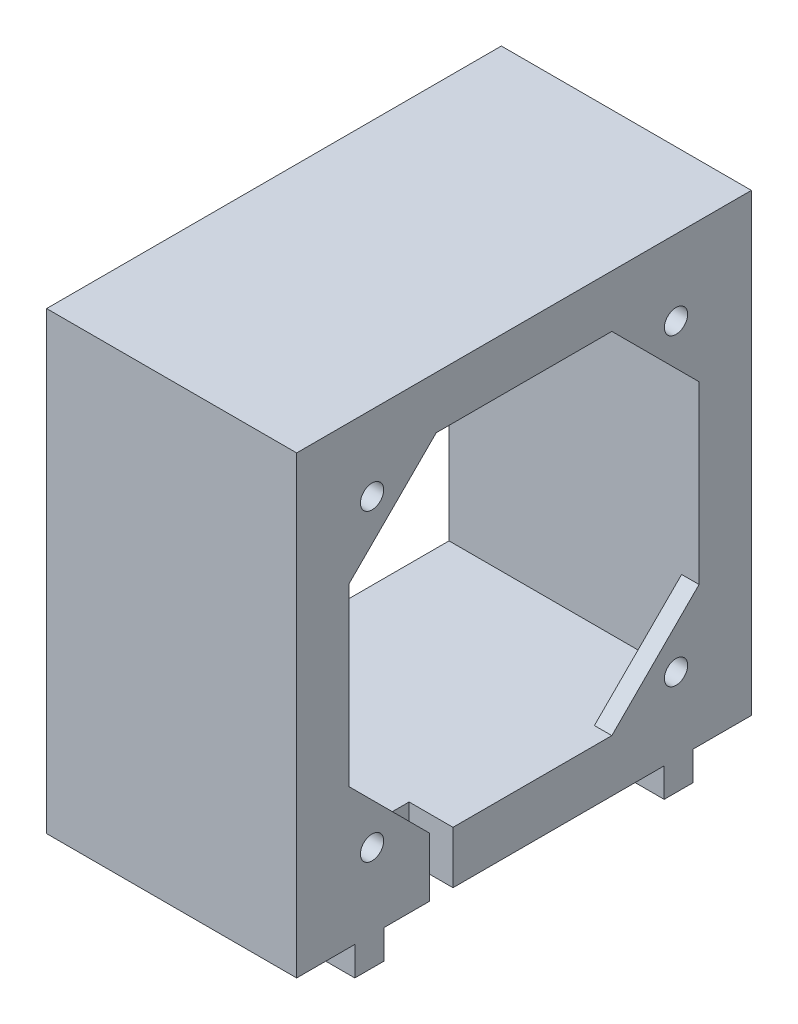
ISO-10303-21;
HEADER;
FILE_DESCRIPTION(('STEP AP214'),'2;1');
FILE_NAME('part.step','',(''),(''),'','','');
FILE_SCHEMA(('AUTOMOTIVE_DESIGN { 1 0 10303 214 1 1 1 1 }'));
ENDSEC;
DATA;
#1=APPLICATION_CONTEXT('core data for automotive mechanical design processes');
#2=APPLICATION_PROTOCOL_DEFINITION('international standard','automotive_design',2000,#1);
#3=PRODUCT_CONTEXT('',#1,'mechanical');
#4=PRODUCT('Part','Part','',(#3));
#5=PRODUCT_RELATED_PRODUCT_CATEGORY('part','',(#4));
#6=PRODUCT_DEFINITION_FORMATION('','',#4);
#7=PRODUCT_DEFINITION_CONTEXT('part definition',#1,'design');
#8=PRODUCT_DEFINITION('design','',#6,#7);
#9=PRODUCT_DEFINITION_SHAPE('','',#8);
#10=(LENGTH_UNIT() NAMED_UNIT(*) SI_UNIT(.MILLI.,.METRE.));
#11=(NAMED_UNIT(*) PLANE_ANGLE_UNIT() SI_UNIT($,.RADIAN.));
#12=(NAMED_UNIT(*) SI_UNIT($,.STERADIAN.) SOLID_ANGLE_UNIT());
#13=UNCERTAINTY_MEASURE_WITH_UNIT(LENGTH_MEASURE(1.E-05),#10,'distance_accuracy_value','');
#14=(GEOMETRIC_REPRESENTATION_CONTEXT(3) GLOBAL_UNCERTAINTY_ASSIGNED_CONTEXT((#13)) GLOBAL_UNIT_ASSIGNED_CONTEXT((#10,
#11,#12)) REPRESENTATION_CONTEXT('',''));
#15=CARTESIAN_POINT('',(0.,0.,0.));
#16=DIRECTION('',(0.,0.,1.));
#17=DIRECTION('',(1.,0.,0.));
#18=AXIS2_PLACEMENT_3D('',#15,#16,#17);
#19=CARTESIAN_POINT('',(40.,-39.1,-39.1));
#20=DIRECTION('',(0.,1.,0.));
#21=DIRECTION('',(0.,0.,1.));
#22=AXIS2_PLACEMENT_3D('',#19,#20,#21);
#23=PLANE('',#22);
#24=DIRECTION('',(1.,0.,0.));
#25=VECTOR('',#24,1.);
#26=CARTESIAN_POINT('',(13.,-39.1,24.1));
#27=LINE('',#26,#25);
#28=CARTESIAN_POINT('',(13.,-39.1,24.1));
#29=VERTEX_POINT('',#28);
#30=CARTESIAN_POINT('',(43.,-39.1,24.1));
#31=VERTEX_POINT('',#30);
#32=EDGE_CURVE('E256',#29,#31,#27,.T.);
#33=ORIENTED_EDGE('',*,*,#32,.F.);
#34=DIRECTION('',(0.,0.,-1.));
#35=VECTOR('',#34,1.);
#36=CARTESIAN_POINT('',(13.,-39.1,29.1));
#37=LINE('',#36,#35);
#38=CARTESIAN_POINT('',(13.,-39.1,29.1));
#39=VERTEX_POINT('',#38);
#40=EDGE_CURVE('E263',#39,#29,#37,.T.);
#41=ORIENTED_EDGE('',*,*,#40,.F.);
#42=DIRECTION('',(-1.,0.,0.));
#43=VECTOR('',#42,1.);
#44=CARTESIAN_POINT('',(13.,-39.1,29.1));
#45=LINE('',#44,#43);
#46=CARTESIAN_POINT('',(43.,-39.1,29.1));
#47=VERTEX_POINT('',#46);
#48=EDGE_CURVE('E245',#47,#39,#45,.T.);
#49=ORIENTED_EDGE('',*,*,#48,.F.);
#50=DIRECTION('',(0.,0.,-1.));
#51=VECTOR('',#50,1.);
#52=CARTESIAN_POINT('',(43.,-39.1,0.));
#53=LINE('',#52,#51);
#54=CARTESIAN_POINT('',(43.,-39.1,39.1));
#55=VERTEX_POINT('',#54);
#56=EDGE_CURVE('E380',#55,#47,#53,.T.);
#57=ORIENTED_EDGE('',*,*,#56,.F.);
#58=DIRECTION('',(-1.,0.,0.));
#59=VECTOR('',#58,1.);
#60=CARTESIAN_POINT('',(40.,-39.1,39.1));
#61=LINE('',#60,#59);
#62=CARTESIAN_POINT('',(0.,-39.1,39.1));
#63=VERTEX_POINT('',#62);
#64=EDGE_CURVE('E503',#55,#63,#61,.T.);
#65=ORIENTED_EDGE('',*,*,#64,.T.);
#66=DIRECTION('',(0.,0.,-1.));
#67=VECTOR('',#66,1.);
#68=CARTESIAN_POINT('',(0.,-39.1,-39.1));
#69=LINE('',#68,#67);
#70=CARTESIAN_POINT('',(0.,-39.1,-39.1));
#71=VERTEX_POINT('',#70);
#72=EDGE_CURVE('E488',#63,#71,#69,.T.);
#73=ORIENTED_EDGE('',*,*,#72,.T.);
#74=DIRECTION('',(-1.,0.,0.));
#75=VECTOR('',#74,1.);
#76=CARTESIAN_POINT('',(40.,-39.1,-39.1));
#77=LINE('',#76,#75);
#78=CARTESIAN_POINT('',(43.,-39.1,-39.1));
#79=VERTEX_POINT('',#78);
#80=EDGE_CURVE('E500',#79,#71,#77,.T.);
#81=ORIENTED_EDGE('',*,*,#80,.F.);
#82=CARTESIAN_POINT('',(43.,-39.1,-29.1));
#83=VERTEX_POINT('',#82);
#84=EDGE_CURVE('E379',#83,#79,#53,.T.);
#85=ORIENTED_EDGE('',*,*,#84,.F.);
#86=DIRECTION('',(1.,0.,0.));
#87=VECTOR('',#86,1.);
#88=CARTESIAN_POINT('',(13.,-39.1,-29.1));
#89=LINE('',#88,#87);
#90=CARTESIAN_POINT('',(13.,-39.1,-29.1));
#91=VERTEX_POINT('',#90);
#92=EDGE_CURVE('E270',#91,#83,#89,.T.);
#93=ORIENTED_EDGE('',*,*,#92,.F.);
#94=DIRECTION('',(0.,0.,-1.));
#95=VECTOR('',#94,1.);
#96=CARTESIAN_POINT('',(13.,-39.1,-29.1));
#97=LINE('',#96,#95);
#98=CARTESIAN_POINT('',(13.,-39.1,-24.1));
#99=VERTEX_POINT('',#98);
#100=EDGE_CURVE('E79',#99,#91,#97,.T.);
#101=ORIENTED_EDGE('',*,*,#100,.F.);
#102=DIRECTION('',(-1.,0.,0.));
#103=VECTOR('',#102,1.);
#104=CARTESIAN_POINT('',(13.,-39.1,-24.1));
#105=LINE('',#104,#103);
#106=CARTESIAN_POINT('',(43.,-39.1,-24.1));
#107=VERTEX_POINT('',#106);
#108=EDGE_CURVE('E284',#107,#99,#105,.T.);
#109=ORIENTED_EDGE('',*,*,#108,.F.);
#110=CARTESIAN_POINT('',(43.,-39.1,12.2154793160125));
#111=VERTEX_POINT('',#110);
#112=EDGE_CURVE('E384',#111,#107,#53,.T.);
#113=ORIENTED_EDGE('',*,*,#112,.F.);
#114=DIRECTION('',(-1.,0.,0.));
#115=VECTOR('',#114,1.);
#116=CARTESIAN_POINT('',(40.,-39.1,12.2154793160125));
#117=LINE('',#116,#115);
#118=CARTESIAN_POINT('',(35.4507809805433,-39.1,12.2154793160125));
#119=VERTEX_POINT('',#118);
#120=EDGE_CURVE('E340',#111,#119,#117,.T.);
#121=ORIENTED_EDGE('',*,*,#120,.T.);
#122=DIRECTION('',(0.,0.,1.));
#123=VECTOR('',#122,1.);
#124=CARTESIAN_POINT('',(35.4507809805433,-39.1,-39.1));
#125=LINE('',#124,#123);
#126=CARTESIAN_POINT('',(35.4507809805433,-39.1,16.2154793160125));
#127=VERTEX_POINT('',#126);
#128=EDGE_CURVE('E343',#119,#127,#125,.T.);
#129=ORIENTED_EDGE('',*,*,#128,.T.);
#130=DIRECTION('',(1.,0.,0.));
#131=VECTOR('',#130,1.);
#132=CARTESIAN_POINT('',(40.,-39.1,16.2154793160125));
#133=LINE('',#132,#131);
#134=CARTESIAN_POINT('',(43.,-39.1,16.2154793160125));
#135=VERTEX_POINT('',#134);
#136=EDGE_CURVE('E335',#127,#135,#133,.T.);
#137=ORIENTED_EDGE('',*,*,#136,.T.);
#138=EDGE_CURVE('E383',#31,#135,#53,.T.);
#139=ORIENTED_EDGE('',*,*,#138,.F.);
#140=EDGE_LOOP('',(#33,#41,#49,#57,#65,#73,#81,#85,#93,#101,#109,#113,#121,#129,#137,#139));
#141=FACE_BOUND('',#140,.T.);
#142=ADVANCED_FACE('F54',(#141),#23,.F.);
#143=CARTESIAN_POINT('',(0.,0.,0.));
#144=DIRECTION('',(-1.,0.,0.));
#145=DIRECTION('',(0.,0.,1.));
#146=AXIS2_PLACEMENT_3D('',#143,#144,#145);
#147=PLANE('',#146);
#148=CARTESIAN_POINT('',(0.,34.6,-34.6));
#149=DIRECTION('',(-1.,0.,0.));
#150=DIRECTION('',(0.,0.,1.));
#151=AXIS2_PLACEMENT_3D('',#148,#149,#150);
#152=CIRCLE('',#151,4.1);
#153=CARTESIAN_POINT('',(0.,34.6,-30.5));
#154=VERTEX_POINT('',#153);
#155=EDGE_CURVE('E58',#154,#154,#152,.T.);
#156=ORIENTED_EDGE('',*,*,#155,.F.);
#157=EDGE_LOOP('',(#156));
#158=FACE_BOUND('',#157,.T.);
#159=CARTESIAN_POINT('',(0.,-34.6,-34.6));
#160=DIRECTION('',(-1.,0.,0.));
#161=DIRECTION('',(0.,0.,1.));
#162=AXIS2_PLACEMENT_3D('',#159,#160,#161);
#163=CIRCLE('',#162,4.1);
#164=CARTESIAN_POINT('',(0.,-34.6,-30.5));
#165=VERTEX_POINT('',#164);
#166=EDGE_CURVE('E514',#165,#165,#163,.T.);
#167=ORIENTED_EDGE('',*,*,#166,.F.);
#168=EDGE_LOOP('',(#167));
#169=FACE_BOUND('',#168,.T.);
#170=CARTESIAN_POINT('',(0.,-34.6,34.6));
#171=DIRECTION('',(-1.,0.,0.));
#172=DIRECTION('',(0.,0.,1.));
#173=AXIS2_PLACEMENT_3D('',#170,#171,#172);
#174=CIRCLE('',#173,4.1);
#175=CARTESIAN_POINT('',(0.,-34.6,38.7));
#176=VERTEX_POINT('',#175);
#177=EDGE_CURVE('E512',#176,#176,#174,.T.);
#178=ORIENTED_EDGE('',*,*,#177,.F.);
#179=EDGE_LOOP('',(#178));
#180=FACE_BOUND('',#179,.T.);
#181=CARTESIAN_POINT('',(0.,34.6,34.6));
#182=DIRECTION('',(-1.,0.,0.));
#183=DIRECTION('',(0.,0.,1.));
#184=AXIS2_PLACEMENT_3D('',#181,#182,#183);
#185=CIRCLE('',#184,4.1);
#186=CARTESIAN_POINT('',(0.,34.6,38.7));
#187=VERTEX_POINT('',#186);
#188=EDGE_CURVE('E321',#187,#187,#185,.T.);
#189=ORIENTED_EDGE('',*,*,#188,.F.);
#190=EDGE_LOOP('',(#189));
#191=FACE_BOUND('',#190,.T.);
#192=DIRECTION('',(0.,-1.,0.));
#193=VECTOR('',#192,1.);
#194=CARTESIAN_POINT('',(0.,39.1,39.1));
#195=LINE('',#194,#193);
#196=CARTESIAN_POINT('',(0.,39.1,39.1));
#197=VERTEX_POINT('',#196);
#198=EDGE_CURVE('E485',#197,#63,#195,.T.);
#199=ORIENTED_EDGE('',*,*,#198,.F.);
#200=DIRECTION('',(0.,0.,1.));
#201=VECTOR('',#200,1.);
#202=CARTESIAN_POINT('',(0.,39.1,-39.1));
#203=LINE('',#202,#201);
#204=CARTESIAN_POINT('',(0.,39.1,-39.1));
#205=VERTEX_POINT('',#204);
#206=EDGE_CURVE('E492',#205,#197,#203,.T.);
#207=ORIENTED_EDGE('',*,*,#206,.F.);
#208=DIRECTION('',(0.,1.,0.));
#209=VECTOR('',#208,1.);
#210=CARTESIAN_POINT('',(0.,39.1,-39.1));
#211=LINE('',#210,#209);
#212=EDGE_CURVE('E490',#71,#205,#211,.T.);
#213=ORIENTED_EDGE('',*,*,#212,.F.);
#214=ORIENTED_EDGE('',*,*,#72,.F.);
#215=EDGE_LOOP('',(#199,#207,#213,#214));
#216=FACE_BOUND('',#215,.T.);
#217=DIRECTION('',(0.,0.,1.));
#218=VECTOR('',#217,1.);
#219=CARTESIAN_POINT('',(0.,30.1,-30.1));
#220=LINE('',#219,#218);
#221=CARTESIAN_POINT('',(0.,30.1,-30.1));
#222=VERTEX_POINT('',#221);
#223=CARTESIAN_POINT('',(0.,30.1,30.1));
#224=VERTEX_POINT('',#223);
#225=EDGE_CURVE('E471',#222,#224,#220,.T.);
#226=ORIENTED_EDGE('',*,*,#225,.T.);
#227=DIRECTION('',(0.,-1.,0.));
#228=VECTOR('',#227,1.);
#229=CARTESIAN_POINT('',(0.,30.1,30.1));
#230=LINE('',#229,#228);
#231=CARTESIAN_POINT('',(0.,-30.1,30.1));
#232=VERTEX_POINT('',#231);
#233=EDGE_CURVE('E442',#224,#232,#230,.T.);
#234=ORIENTED_EDGE('',*,*,#233,.T.);
#235=DIRECTION('',(0.,0.,-1.));
#236=VECTOR('',#235,1.);
#237=CARTESIAN_POINT('',(0.,-30.1,-30.1));
#238=LINE('',#237,#236);
#239=CARTESIAN_POINT('',(0.,-30.1,-30.1));
#240=VERTEX_POINT('',#239);
#241=EDGE_CURVE('E464',#232,#240,#238,.T.);
#242=ORIENTED_EDGE('',*,*,#241,.T.);
#243=DIRECTION('',(0.,1.,0.));
#244=VECTOR('',#243,1.);
#245=CARTESIAN_POINT('',(0.,30.1,-30.1));
#246=LINE('',#245,#244);
#247=EDGE_CURVE('E467',#240,#222,#246,.T.);
#248=ORIENTED_EDGE('',*,*,#247,.T.);
#249=EDGE_LOOP('',(#226,#234,#242,#248));
#250=FACE_BOUND('',#249,.T.);
#251=ADVANCED_FACE('F524',(#158,#169,#180,#191,#216,#250),#147,.T.);
#252=CARTESIAN_POINT('',(40.,39.1,39.1));
#253=DIRECTION('',(0.,0.,-1.));
#254=DIRECTION('',(-1.,0.,0.));
#255=AXIS2_PLACEMENT_3D('',#252,#253,#254);
#256=PLANE('',#255);
#257=ORIENTED_EDGE('',*,*,#198,.T.);
#258=ORIENTED_EDGE('',*,*,#64,.F.);
#259=DIRECTION('',(0.,-1.,0.));
#260=VECTOR('',#259,1.);
#261=CARTESIAN_POINT('',(43.,0.,39.1));
#262=LINE('',#261,#260);
#263=CARTESIAN_POINT('',(43.,39.1,39.1));
#264=VERTEX_POINT('',#263);
#265=EDGE_CURVE('E376',#264,#55,#262,.T.);
#266=ORIENTED_EDGE('',*,*,#265,.F.);
#267=DIRECTION('',(-1.,0.,0.));
#268=VECTOR('',#267,1.);
#269=CARTESIAN_POINT('',(40.,39.1,39.1));
#270=LINE('',#269,#268);
#271=EDGE_CURVE('E494',#264,#197,#270,.T.);
#272=ORIENTED_EDGE('',*,*,#271,.T.);
#273=EDGE_LOOP('',(#257,#258,#266,#272));
#274=FACE_BOUND('',#273,.T.);
#275=ADVANCED_FACE('F56',(#274),#256,.F.);
#276=CARTESIAN_POINT('',(40.,39.1,-39.1));
#277=DIRECTION('',(0.,0.,1.));
#278=DIRECTION('',(1.,0.,0.));
#279=AXIS2_PLACEMENT_3D('',#276,#277,#278);
#280=PLANE('',#279);
#281=ORIENTED_EDGE('',*,*,#212,.T.);
#282=DIRECTION('',(-1.,0.,0.));
#283=VECTOR('',#282,1.);
#284=CARTESIAN_POINT('',(40.,39.1,-39.1));
#285=LINE('',#284,#283);
#286=CARTESIAN_POINT('',(43.,39.1,-39.1));
#287=VERTEX_POINT('',#286);
#288=EDGE_CURVE('E497',#287,#205,#285,.T.);
#289=ORIENTED_EDGE('',*,*,#288,.F.);
#290=DIRECTION('',(0.,1.,0.));
#291=VECTOR('',#290,1.);
#292=CARTESIAN_POINT('',(43.,0.,-39.1));
#293=LINE('',#292,#291);
#294=EDGE_CURVE('E382',#79,#287,#293,.T.);
#295=ORIENTED_EDGE('',*,*,#294,.F.);
#296=ORIENTED_EDGE('',*,*,#80,.T.);
#297=EDGE_LOOP('',(#281,#289,#295,#296));
#298=FACE_BOUND('',#297,.T.);
#299=ADVANCED_FACE('F610',(#298),#280,.F.);
#300=CARTESIAN_POINT('',(40.,39.1,-39.1));
#301=DIRECTION('',(0.,-1.,0.));
#302=DIRECTION('',(0.,0.,-1.));
#303=AXIS2_PLACEMENT_3D('',#300,#301,#302);
#304=PLANE('',#303);
#305=ORIENTED_EDGE('',*,*,#206,.T.);
#306=ORIENTED_EDGE('',*,*,#271,.F.);
#307=DIRECTION('',(0.,0.,1.));
#308=VECTOR('',#307,1.);
#309=CARTESIAN_POINT('',(43.,39.1,0.));
#310=LINE('',#309,#308);
#311=EDGE_CURVE('E373',#287,#264,#310,.T.);
#312=ORIENTED_EDGE('',*,*,#311,.F.);
#313=ORIENTED_EDGE('',*,*,#288,.T.);
#314=EDGE_LOOP('',(#305,#306,#312,#313));
#315=FACE_BOUND('',#314,.T.);
#316=ADVANCED_FACE('F613',(#315),#304,.F.);
#317=CARTESIAN_POINT('',(40.,30.1,30.1));
#318=DIRECTION('',(0.,0.,-1.));
#319=DIRECTION('',(0.,1.,0.));
#320=AXIS2_PLACEMENT_3D('',#317,#318,#319);
#321=PLANE('',#320);
#322=ORIENTED_EDGE('',*,*,#233,.F.);
#323=DIRECTION('',(-1.,0.,0.));
#324=VECTOR('',#323,1.);
#325=CARTESIAN_POINT('',(40.,30.1,30.1));
#326=LINE('',#325,#324);
#327=CARTESIAN_POINT('',(40.,30.1,30.1));
#328=VERTEX_POINT('',#327);
#329=EDGE_CURVE('E461',#328,#224,#326,.T.);
#330=ORIENTED_EDGE('',*,*,#329,.F.);
#331=DIRECTION('',(0.,-1.,0.));
#332=VECTOR('',#331,1.);
#333=CARTESIAN_POINT('',(40.,30.1,30.1));
#334=LINE('',#333,#332);
#335=CARTESIAN_POINT('',(40.,15.1,30.1));
#336=VERTEX_POINT('',#335);
#337=EDGE_CURVE('E443',#328,#336,#334,.T.);
#338=ORIENTED_EDGE('',*,*,#337,.T.);
#339=DIRECTION('',(-1.,0.,0.));
#340=VECTOR('',#339,1.);
#341=CARTESIAN_POINT('',(43.,15.1,30.1));
#342=LINE('',#341,#340);
#343=CARTESIAN_POINT('',(43.,15.1,30.1));
#344=VERTEX_POINT('',#343);
#345=EDGE_CURVE('E434',#344,#336,#342,.T.);
#346=ORIENTED_EDGE('',*,*,#345,.F.);
#347=DIRECTION('',(0.,1.,0.));
#348=VECTOR('',#347,1.);
#349=CARTESIAN_POINT('',(43.,0.,30.1));
#350=LINE('',#349,#348);
#351=CARTESIAN_POINT('',(43.,-15.0999999999999,30.1));
#352=VERTEX_POINT('',#351);
#353=EDGE_CURVE('E357',#352,#344,#350,.T.);
#354=ORIENTED_EDGE('',*,*,#353,.F.);
#355=DIRECTION('',(-1.,0.,0.));
#356=VECTOR('',#355,1.);
#357=CARTESIAN_POINT('',(43.,-15.0999999999999,30.1));
#358=LINE('',#357,#356);
#359=CARTESIAN_POINT('',(40.,-15.0999999999999,30.1));
#360=VERTEX_POINT('',#359);
#361=EDGE_CURVE('E436',#352,#360,#358,.T.);
#362=ORIENTED_EDGE('',*,*,#361,.T.);
#363=CARTESIAN_POINT('',(40.,-30.1,30.1));
#364=VERTEX_POINT('',#363);
#365=EDGE_CURVE('E447',#360,#364,#334,.T.);
#366=ORIENTED_EDGE('',*,*,#365,.T.);
#367=DIRECTION('',(-1.,0.,0.));
#368=VECTOR('',#367,1.);
#369=CARTESIAN_POINT('',(40.,-30.1,30.1));
#370=LINE('',#369,#368);
#371=EDGE_CURVE('E482',#364,#232,#370,.T.);
#372=ORIENTED_EDGE('',*,*,#371,.T.);
#373=EDGE_LOOP('',(#322,#330,#338,#346,#354,#362,#366,#372));
#374=FACE_BOUND('',#373,.T.);
#375=ADVANCED_FACE('F544',(#374),#321,.T.);
#376=CARTESIAN_POINT('',(40.,-30.1,-30.1));
#377=DIRECTION('',(0.,1.,0.));
#378=DIRECTION('',(0.,0.,1.));
#379=AXIS2_PLACEMENT_3D('',#376,#377,#378);
#380=PLANE('',#379);
#381=DIRECTION('',(-1.,0.,0.));
#382=VECTOR('',#381,1.);
#383=CARTESIAN_POINT('',(40.,-30.1,12.2154793160125));
#384=LINE('',#383,#382);
#385=CARTESIAN_POINT('',(43.,-30.1,12.2154793160125));
#386=VERTEX_POINT('',#385);
#387=CARTESIAN_POINT('',(35.4507809805433,-30.1,12.2154793160125));
#388=VERTEX_POINT('',#387);
#389=EDGE_CURVE('E338',#386,#388,#384,.T.);
#390=ORIENTED_EDGE('',*,*,#389,.F.);
#391=DIRECTION('',(0.,0.,1.));
#392=VECTOR('',#391,1.);
#393=CARTESIAN_POINT('',(43.,-30.1,0.));
#394=LINE('',#393,#392);
#395=CARTESIAN_POINT('',(43.,-30.1,-15.0999999999999));
#396=VERTEX_POINT('',#395);
#397=EDGE_CURVE('E350',#396,#386,#394,.T.);
#398=ORIENTED_EDGE('',*,*,#397,.F.);
#399=DIRECTION('',(-1.,0.,0.));
#400=VECTOR('',#399,1.);
#401=CARTESIAN_POINT('',(43.,-30.1,-15.0999999999999));
#402=LINE('',#401,#400);
#403=CARTESIAN_POINT('',(40.,-30.1,-15.0999999999999));
#404=VERTEX_POINT('',#403);
#405=EDGE_CURVE('E439',#396,#404,#402,.T.);
#406=ORIENTED_EDGE('',*,*,#405,.T.);
#407=DIRECTION('',(0.,0.,-1.));
#408=VECTOR('',#407,1.);
#409=CARTESIAN_POINT('',(40.,-30.1,-30.1));
#410=LINE('',#409,#408);
#411=CARTESIAN_POINT('',(40.,-30.1,-30.1));
#412=VERTEX_POINT('',#411);
#413=EDGE_CURVE('E446',#404,#412,#410,.T.);
#414=ORIENTED_EDGE('',*,*,#413,.T.);
#415=DIRECTION('',(-1.,0.,0.));
#416=VECTOR('',#415,1.);
#417=CARTESIAN_POINT('',(40.,-30.1,-30.1));
#418=LINE('',#417,#416);
#419=EDGE_CURVE('E479',#412,#240,#418,.T.);
#420=ORIENTED_EDGE('',*,*,#419,.T.);
#421=ORIENTED_EDGE('',*,*,#241,.F.);
#422=ORIENTED_EDGE('',*,*,#371,.F.);
#423=CARTESIAN_POINT('',(40.,-30.1,16.2154793160125));
#424=VERTEX_POINT('',#423);
#425=EDGE_CURVE('E448',#364,#424,#410,.T.);
#426=ORIENTED_EDGE('',*,*,#425,.T.);
#427=DIRECTION('',(1.,0.,0.));
#428=VECTOR('',#427,1.);
#429=CARTESIAN_POINT('',(40.,-30.1,16.2154793160125));
#430=LINE('',#429,#428);
#431=CARTESIAN_POINT('',(35.4507809805433,-30.1,16.2154793160125));
#432=VERTEX_POINT('',#431);
#433=EDGE_CURVE('E333',#432,#424,#430,.T.);
#434=ORIENTED_EDGE('',*,*,#433,.F.);
#435=DIRECTION('',(0.,0.,1.));
#436=VECTOR('',#435,1.);
#437=CARTESIAN_POINT('',(35.4507809805433,-30.1,-30.1));
#438=LINE('',#437,#436);
#439=EDGE_CURVE('E12',#388,#432,#438,.T.);
#440=ORIENTED_EDGE('',*,*,#439,.F.);
#441=EDGE_LOOP('',(#390,#398,#406,#414,#420,#421,#422,#426,#434,#440));
#442=FACE_BOUND('',#441,.T.);
#443=ADVANCED_FACE('F550',(#442),#380,.T.);
#444=CARTESIAN_POINT('',(40.,30.1,-30.1));
#445=DIRECTION('',(0.,0.,1.));
#446=DIRECTION('',(0.,-1.,0.));
#447=AXIS2_PLACEMENT_3D('',#444,#445,#446);
#448=PLANE('',#447);
#449=ORIENTED_EDGE('',*,*,#247,.F.);
#450=ORIENTED_EDGE('',*,*,#419,.F.);
#451=DIRECTION('',(0.,1.,0.));
#452=VECTOR('',#451,1.);
#453=CARTESIAN_POINT('',(40.,30.1,-30.1));
#454=LINE('',#453,#452);
#455=CARTESIAN_POINT('',(40.,-15.1000000000001,-30.1));
#456=VERTEX_POINT('',#455);
#457=EDGE_CURVE('E452',#412,#456,#454,.T.);
#458=ORIENTED_EDGE('',*,*,#457,.T.);
#459=DIRECTION('',(-1.,0.,0.));
#460=VECTOR('',#459,1.);
#461=CARTESIAN_POINT('',(43.,-15.1000000000001,-30.1));
#462=LINE('',#461,#460);
#463=CARTESIAN_POINT('',(43.,-15.1000000000001,-30.1));
#464=VERTEX_POINT('',#463);
#465=EDGE_CURVE('E396',#464,#456,#462,.T.);
#466=ORIENTED_EDGE('',*,*,#465,.F.);
#467=DIRECTION('',(0.,-1.,0.));
#468=VECTOR('',#467,1.);
#469=CARTESIAN_POINT('',(43.,0.,-30.1));
#470=LINE('',#469,#468);
#471=CARTESIAN_POINT('',(43.,15.0999999999999,-30.1));
#472=VERTEX_POINT('',#471);
#473=EDGE_CURVE('E367',#472,#464,#470,.T.);
#474=ORIENTED_EDGE('',*,*,#473,.F.);
#475=DIRECTION('',(-1.,0.,0.));
#476=VECTOR('',#475,1.);
#477=CARTESIAN_POINT('',(43.,15.0999999999999,-30.1));
#478=LINE('',#477,#476);
#479=CARTESIAN_POINT('',(40.,15.0999999999999,-30.1));
#480=VERTEX_POINT('',#479);
#481=EDGE_CURVE('E425',#472,#480,#478,.T.);
#482=ORIENTED_EDGE('',*,*,#481,.T.);
#483=CARTESIAN_POINT('',(40.,30.1,-30.1));
#484=VERTEX_POINT('',#483);
#485=EDGE_CURVE('E451',#480,#484,#454,.T.);
#486=ORIENTED_EDGE('',*,*,#485,.T.);
#487=DIRECTION('',(-1.,0.,0.));
#488=VECTOR('',#487,1.);
#489=CARTESIAN_POINT('',(40.,30.1,-30.1));
#490=LINE('',#489,#488);
#491=EDGE_CURVE('E476',#484,#222,#490,.T.);
#492=ORIENTED_EDGE('',*,*,#491,.T.);
#493=EDGE_LOOP('',(#449,#450,#458,#466,#474,#482,#486,#492));
#494=FACE_BOUND('',#493,.T.);
#495=ADVANCED_FACE('F555',(#494),#448,.T.);
#496=CARTESIAN_POINT('',(40.,30.1,-30.1));
#497=DIRECTION('',(0.,-1.,0.));
#498=DIRECTION('',(0.,0.,-1.));
#499=AXIS2_PLACEMENT_3D('',#496,#497,#498);
#500=PLANE('',#499);
#501=ORIENTED_EDGE('',*,*,#225,.F.);
#502=ORIENTED_EDGE('',*,*,#491,.F.);
#503=DIRECTION('',(0.,0.,1.));
#504=VECTOR('',#503,1.);
#505=CARTESIAN_POINT('',(40.,30.1,-30.1));
#506=LINE('',#505,#504);
#507=CARTESIAN_POINT('',(40.,30.1,-15.1));
#508=VERTEX_POINT('',#507);
#509=EDGE_CURVE('E457',#484,#508,#506,.T.);
#510=ORIENTED_EDGE('',*,*,#509,.T.);
#511=DIRECTION('',(-1.,0.,0.));
#512=VECTOR('',#511,1.);
#513=CARTESIAN_POINT('',(43.,30.1,-15.1));
#514=LINE('',#513,#512);
#515=CARTESIAN_POINT('',(43.,30.1,-15.1));
#516=VERTEX_POINT('',#515);
#517=EDGE_CURVE('E429',#516,#508,#514,.T.);
#518=ORIENTED_EDGE('',*,*,#517,.F.);
#519=DIRECTION('',(0.,0.,-1.));
#520=VECTOR('',#519,1.);
#521=CARTESIAN_POINT('',(43.,30.1,0.));
#522=LINE('',#521,#520);
#523=CARTESIAN_POINT('',(43.,30.1,15.1));
#524=VERTEX_POINT('',#523);
#525=EDGE_CURVE('E362',#524,#516,#522,.T.);
#526=ORIENTED_EDGE('',*,*,#525,.F.);
#527=DIRECTION('',(-1.,0.,0.));
#528=VECTOR('',#527,1.);
#529=CARTESIAN_POINT('',(43.,30.1,15.1));
#530=LINE('',#529,#528);
#531=CARTESIAN_POINT('',(40.,30.1,15.1));
#532=VERTEX_POINT('',#531);
#533=EDGE_CURVE('E431',#524,#532,#530,.T.);
#534=ORIENTED_EDGE('',*,*,#533,.T.);
#535=EDGE_CURVE('E456',#532,#328,#506,.T.);
#536=ORIENTED_EDGE('',*,*,#535,.T.);
#537=ORIENTED_EDGE('',*,*,#329,.T.);
#538=EDGE_LOOP('',(#501,#502,#510,#518,#526,#534,#536,#537));
#539=FACE_BOUND('',#538,.T.);
#540=ADVANCED_FACE('F540',(#539),#500,.T.);
#541=CARTESIAN_POINT('',(40.,0.,0.));
#542=DIRECTION('',(1.,0.,0.));
#543=DIRECTION('',(0.,0.,-1.));
#544=AXIS2_PLACEMENT_3D('',#541,#542,#543);
#545=PLANE('',#544);
#546=ORIENTED_EDGE('',*,*,#337,.F.);
#547=ORIENTED_EDGE('',*,*,#535,.F.);
#548=DIRECTION('',(0.,-0.707106781186548,0.707106781186547));
#549=VECTOR('',#548,1.);
#550=CARTESIAN_POINT('',(40.,22.6,22.6));
#551=LINE('',#550,#549);
#552=EDGE_CURVE('E403',#532,#336,#551,.T.);
#553=ORIENTED_EDGE('',*,*,#552,.T.);
#554=EDGE_LOOP('',(#546,#547,#553));
#555=FACE_BOUND('',#554,.T.);
#556=CARTESIAN_POINT('',(40.,26.1355339059327,26.1355339059327));
#557=DIRECTION('',(1.,0.,0.));
#558=DIRECTION('',(0.,0.,-1.));
#559=AXIS2_PLACEMENT_3D('',#556,#557,#558);
#560=CIRCLE('',#559,2.);
#561=CARTESIAN_POINT('',(40.,26.1355339059327,24.1355339059327));
#562=VERTEX_POINT('',#561);
#563=EDGE_CURVE('E410',#562,#562,#560,.T.);
#564=ORIENTED_EDGE('',*,*,#563,.T.);
#565=EDGE_LOOP('',(#564));
#566=FACE_BOUND('',#565,.T.);
#567=ADVANCED_FACE('F581',(#555,#566),#545,.F.);
#568=ORIENTED_EDGE('',*,*,#509,.F.);
#569=ORIENTED_EDGE('',*,*,#485,.F.);
#570=DIRECTION('',(0.,0.70710678118655,0.707106781186545));
#571=VECTOR('',#570,1.);
#572=CARTESIAN_POINT('',(40.,22.5999999999999,-22.6000000000001));
#573=LINE('',#572,#571);
#574=EDGE_CURVE('E406',#480,#508,#573,.T.);
#575=ORIENTED_EDGE('',*,*,#574,.T.);
#576=EDGE_LOOP('',(#568,#569,#575));
#577=FACE_BOUND('',#576,.T.);
#578=CARTESIAN_POINT('',(40.,26.1355339059335,-26.1355339059327));
#579=DIRECTION('',(1.,0.,0.));
#580=DIRECTION('',(0.,0.,-1.));
#581=AXIS2_PLACEMENT_3D('',#578,#579,#580);
#582=CIRCLE('',#581,2.00000000000083);
#583=CARTESIAN_POINT('',(40.,26.1355339059335,-28.1355339059336));
#584=VERTEX_POINT('',#583);
#585=EDGE_CURVE('E417',#584,#584,#582,.T.);
#586=ORIENTED_EDGE('',*,*,#585,.T.);
#587=EDGE_LOOP('',(#586));
#588=FACE_BOUND('',#587,.T.);
#589=ADVANCED_FACE('F562',(#577,#588),#545,.F.);
#590=DIRECTION('',(0.,-0.707106781186555,-0.707106781186541));
#591=VECTOR('',#590,1.);
#592=CARTESIAN_POINT('',(40.,-22.5999999999998,22.6000000000002));
#593=LINE('',#592,#591);
#594=CARTESIAN_POINT('',(40.,-28.9845206839876,16.2154793160125));
#595=VERTEX_POINT('',#594);
#596=EDGE_CURVE('E400',#360,#595,#593,.T.);
#597=ORIENTED_EDGE('',*,*,#596,.T.);
#598=DIRECTION('',(0.,-1.,0.));
#599=VECTOR('',#598,1.);
#600=CARTESIAN_POINT('',(40.,0.,16.2154793160125));
#601=LINE('',#600,#599);
#602=EDGE_CURVE('E330',#595,#424,#601,.T.);
#603=ORIENTED_EDGE('',*,*,#602,.T.);
#604=ORIENTED_EDGE('',*,*,#425,.F.);
#605=ORIENTED_EDGE('',*,*,#365,.F.);
#606=EDGE_LOOP('',(#597,#603,#604,#605));
#607=FACE_BOUND('',#606,.T.);
#608=CARTESIAN_POINT('',(40.,-26.1355339059327,26.135533905932));
#609=DIRECTION('',(1.,0.,0.));
#610=DIRECTION('',(0.,0.,-1.));
#611=AXIS2_PLACEMENT_3D('',#608,#609,#610);
#612=CIRCLE('',#611,2.00000000000057);
#613=CARTESIAN_POINT('',(40.,-26.1355339059327,24.1355339059314));
#614=VERTEX_POINT('',#613);
#615=EDGE_CURVE('E351',#614,#614,#612,.T.);
#616=ORIENTED_EDGE('',*,*,#615,.T.);
#617=EDGE_LOOP('',(#616));
#618=FACE_BOUND('',#617,.T.);
#619=ADVANCED_FACE('F630',(#607,#618),#545,.F.);
#620=CARTESIAN_POINT('',(43.,-22.6000000000002,-22.5999999999998));
#621=DIRECTION('',(0.,0.707106781186552,0.707106781186543));
#622=DIRECTION('',(0.,-0.707106781186543,0.707106781186552));
#623=AXIS2_PLACEMENT_3D('',#620,#621,#622);
#624=PLANE('',#623);
#625=DIRECTION('',(0.,0.707106781186543,-0.707106781186552));
#626=VECTOR('',#625,1.);
#627=CARTESIAN_POINT('',(40.,-22.6000000000002,-22.5999999999998));
#628=LINE('',#627,#626);
#629=EDGE_CURVE('E346',#404,#456,#628,.T.);
#630=ORIENTED_EDGE('',*,*,#629,.F.);
#631=ORIENTED_EDGE('',*,*,#405,.F.);
#632=DIRECTION('',(0.,0.707106781186543,-0.707106781186552));
#633=VECTOR('',#632,1.);
#634=CARTESIAN_POINT('',(43.,-22.6000000000002,-22.5999999999998));
#635=LINE('',#634,#633);
#636=EDGE_CURVE('E347',#396,#464,#635,.T.);
#637=ORIENTED_EDGE('',*,*,#636,.T.);
#638=ORIENTED_EDGE('',*,*,#465,.T.);
#639=EDGE_LOOP('',(#630,#631,#637,#638));
#640=FACE_BOUND('',#639,.T.);
#641=ADVANCED_FACE('F626',(#640),#624,.T.);
#642=CARTESIAN_POINT('',(43.,-22.5999999999998,22.6000000000002));
#643=DIRECTION('',(0.,0.70710678118654,-0.707106781186554));
#644=DIRECTION('',(0.,0.707106781186554,0.70710678118654));
#645=AXIS2_PLACEMENT_3D('',#642,#643,#644);
#646=PLANE('',#645);
#647=DIRECTION('',(1.,0.,0.));
#648=VECTOR('',#647,1.);
#649=CARTESIAN_POINT('',(43.,-28.9845206839876,16.2154793160125));
#650=LINE('',#649,#648);
#651=CARTESIAN_POINT('',(43.,-28.9845206839876,16.2154793160125));
#652=VERTEX_POINT('',#651);
#653=EDGE_CURVE('E325',#595,#652,#650,.T.);
#654=ORIENTED_EDGE('',*,*,#653,.F.);
#655=ORIENTED_EDGE('',*,*,#596,.F.);
#656=ORIENTED_EDGE('',*,*,#361,.F.);
#657=DIRECTION('',(0.,-0.707106781186555,-0.707106781186541));
#658=VECTOR('',#657,1.);
#659=CARTESIAN_POINT('',(43.,-22.5999999999998,22.6000000000002));
#660=LINE('',#659,#658);
#661=EDGE_CURVE('E354',#352,#652,#660,.T.);
#662=ORIENTED_EDGE('',*,*,#661,.T.);
#663=EDGE_LOOP('',(#654,#655,#656,#662));
#664=FACE_BOUND('',#663,.T.);
#665=ADVANCED_FACE('F629',(#664),#646,.T.);
#666=CARTESIAN_POINT('',(43.,22.6,22.6));
#667=DIRECTION('',(0.,-0.707106781186547,-0.707106781186548));
#668=DIRECTION('',(0.,0.707106781186548,-0.707106781186547));
#669=AXIS2_PLACEMENT_3D('',#666,#667,#668);
#670=PLANE('',#669);
#671=ORIENTED_EDGE('',*,*,#552,.F.);
#672=ORIENTED_EDGE('',*,*,#533,.F.);
#673=DIRECTION('',(0.,-0.707106781186548,0.707106781186547));
#674=VECTOR('',#673,1.);
#675=CARTESIAN_POINT('',(43.,22.6,22.6));
#676=LINE('',#675,#674);
#677=EDGE_CURVE('E359',#524,#344,#676,.T.);
#678=ORIENTED_EDGE('',*,*,#677,.T.);
#679=ORIENTED_EDGE('',*,*,#345,.T.);
#680=EDGE_LOOP('',(#671,#672,#678,#679));
#681=FACE_BOUND('',#680,.T.);
#682=ADVANCED_FACE('F579',(#681),#670,.T.);
#683=CARTESIAN_POINT('',(43.,22.5999999999999,-22.6000000000001));
#684=DIRECTION('',(0.,-0.707106781186545,0.70710678118655));
#685=DIRECTION('',(0.,-0.70710678118655,-0.707106781186545));
#686=AXIS2_PLACEMENT_3D('',#683,#684,#685);
#687=PLANE('',#686);
#688=ORIENTED_EDGE('',*,*,#574,.F.);
#689=ORIENTED_EDGE('',*,*,#481,.F.);
#690=DIRECTION('',(0.,0.70710678118655,0.707106781186545));
#691=VECTOR('',#690,1.);
#692=CARTESIAN_POINT('',(43.,22.5999999999999,-22.6000000000001));
#693=LINE('',#692,#691);
#694=EDGE_CURVE('E364',#472,#516,#693,.T.);
#695=ORIENTED_EDGE('',*,*,#694,.T.);
#696=ORIENTED_EDGE('',*,*,#517,.T.);
#697=EDGE_LOOP('',(#688,#689,#695,#696));
#698=FACE_BOUND('',#697,.T.);
#699=ADVANCED_FACE('F569',(#698),#687,.T.);
#700=CARTESIAN_POINT('',(43.,26.1355339059335,-26.1355339059327));
#701=DIRECTION('',(-1.,0.,0.));
#702=DIRECTION('',(0.,0.,1.));
#703=AXIS2_PLACEMENT_3D('',#700,#701,#702);
#704=CYLINDRICAL_SURFACE('',#703,2.00000000000083);
#705=CARTESIAN_POINT('',(43.,26.1355339059335,-26.1355339059327));
#706=DIRECTION('',(1.,0.,0.));
#707=DIRECTION('',(0.,0.,-1.));
#708=AXIS2_PLACEMENT_3D('',#705,#706,#707);
#709=CIRCLE('',#708,2.00000000000083);
#710=CARTESIAN_POINT('',(43.,26.1355339059335,-28.1355339059336));
#711=VERTEX_POINT('',#710);
#712=EDGE_CURVE('E390',#711,#711,#709,.T.);
#713=ORIENTED_EDGE('',*,*,#712,.T.);
#714=EDGE_LOOP('',(#713));
#715=FACE_BOUND('',#714,.T.);
#716=ORIENTED_EDGE('',*,*,#585,.F.);
#717=EDGE_LOOP('',(#716));
#718=FACE_BOUND('',#717,.T.);
#719=ADVANCED_FACE('F600',(#715,#718),#704,.F.);
#720=CARTESIAN_POINT('',(43.,-26.135533905932,-26.1355339059335));
#721=DIRECTION('',(-1.,0.,0.));
#722=DIRECTION('',(0.,0.,1.));
#723=AXIS2_PLACEMENT_3D('',#720,#721,#722);
#724=CYLINDRICAL_SURFACE('',#723,2.00000000000117);
#725=CARTESIAN_POINT('',(43.,-26.135533905932,-26.1355339059335));
#726=DIRECTION('',(1.,0.,0.));
#727=DIRECTION('',(0.,0.,-1.));
#728=AXIS2_PLACEMENT_3D('',#725,#726,#727);
#729=CIRCLE('',#728,2.00000000000117);
#730=CARTESIAN_POINT('',(43.,-26.135533905932,-28.1355339059347));
#731=VERTEX_POINT('',#730);
#732=EDGE_CURVE('E387',#731,#731,#729,.T.);
#733=ORIENTED_EDGE('',*,*,#732,.T.);
#734=EDGE_LOOP('',(#733));
#735=FACE_BOUND('',#734,.T.);
#736=CARTESIAN_POINT('',(40.,-26.135533905932,-26.1355339059335));
#737=DIRECTION('',(1.,0.,0.));
#738=DIRECTION('',(0.,0.,-1.));
#739=AXIS2_PLACEMENT_3D('',#736,#737,#738);
#740=CIRCLE('',#739,2.00000000000117);
#741=CARTESIAN_POINT('',(40.,-26.135533905932,-28.1355339059347));
#742=VERTEX_POINT('',#741);
#743=EDGE_CURVE('E413',#742,#742,#740,.T.);
#744=ORIENTED_EDGE('',*,*,#743,.F.);
#745=EDGE_LOOP('',(#744));
#746=FACE_BOUND('',#745,.T.);
#747=ADVANCED_FACE('F591',(#735,#746),#724,.F.);
#748=CARTESIAN_POINT('',(43.,26.1355339059327,26.1355339059327));
#749=DIRECTION('',(-1.,0.,0.));
#750=DIRECTION('',(0.,0.,1.));
#751=AXIS2_PLACEMENT_3D('',#748,#749,#750);
#752=CYLINDRICAL_SURFACE('',#751,2.);
#753=CARTESIAN_POINT('',(43.,26.1355339059327,26.1355339059327));
#754=DIRECTION('',(1.,0.,0.));
#755=DIRECTION('',(0.,0.,-1.));
#756=AXIS2_PLACEMENT_3D('',#753,#754,#755);
#757=CIRCLE('',#756,2.);
#758=CARTESIAN_POINT('',(43.,26.1355339059327,24.1355339059327));
#759=VERTEX_POINT('',#758);
#760=EDGE_CURVE('E370',#759,#759,#757,.T.);
#761=ORIENTED_EDGE('',*,*,#760,.T.);
#762=EDGE_LOOP('',(#761));
#763=FACE_BOUND('',#762,.T.);
#764=ORIENTED_EDGE('',*,*,#563,.F.);
#765=EDGE_LOOP('',(#764));
#766=FACE_BOUND('',#765,.T.);
#767=ADVANCED_FACE('F588',(#763,#766),#752,.F.);
#768=CARTESIAN_POINT('',(43.,-26.1355339059327,26.135533905932));
#769=DIRECTION('',(-1.,0.,0.));
#770=DIRECTION('',(0.,0.,1.));
#771=AXIS2_PLACEMENT_3D('',#768,#769,#770);
#772=CYLINDRICAL_SURFACE('',#771,2.00000000000057);
#773=CARTESIAN_POINT('',(43.,-26.1355339059327,26.135533905932));
#774=DIRECTION('',(1.,0.,0.));
#775=DIRECTION('',(0.,0.,-1.));
#776=AXIS2_PLACEMENT_3D('',#773,#774,#775);
#777=CIRCLE('',#776,2.00000000000057);
#778=CARTESIAN_POINT('',(43.,-26.1355339059327,24.1355339059314));
#779=VERTEX_POINT('',#778);
#780=EDGE_CURVE('E393',#779,#779,#777,.T.);
#781=ORIENTED_EDGE('',*,*,#780,.T.);
#782=EDGE_LOOP('',(#781));
#783=FACE_BOUND('',#782,.T.);
#784=ORIENTED_EDGE('',*,*,#615,.F.);
#785=EDGE_LOOP('',(#784));
#786=FACE_BOUND('',#785,.T.);
#787=ADVANCED_FACE('F590',(#783,#786),#772,.F.);
#788=CARTESIAN_POINT('',(43.,0.,0.));
#789=DIRECTION('',(1.,0.,0.));
#790=DIRECTION('',(0.,0.,-1.));
#791=AXIS2_PLACEMENT_3D('',#788,#789,#790);
#792=PLANE('',#791);
#793=DIRECTION('',(0.,1.,0.));
#794=VECTOR('',#793,1.);
#795=CARTESIAN_POINT('',(43.,0.,12.2154793160125));
#796=LINE('',#795,#794);
#797=EDGE_CURVE('E63',#111,#386,#796,.T.);
#798=ORIENTED_EDGE('',*,*,#797,.F.);
#799=ORIENTED_EDGE('',*,*,#112,.T.);
#800=DIRECTION('',(0.,1.,0.));
#801=VECTOR('',#800,1.);
#802=CARTESIAN_POINT('',(43.,-44.1,-24.1));
#803=LINE('',#802,#801);
#804=CARTESIAN_POINT('',(43.,-44.1,-24.1));
#805=VERTEX_POINT('',#804);
#806=EDGE_CURVE('E300',#805,#107,#803,.T.);
#807=ORIENTED_EDGE('',*,*,#806,.F.);
#808=DIRECTION('',(0.,0.,1.));
#809=VECTOR('',#808,1.);
#810=CARTESIAN_POINT('',(43.,-44.1,-29.1));
#811=LINE('',#810,#809);
#812=CARTESIAN_POINT('',(43.,-44.1,-29.1));
#813=VERTEX_POINT('',#812);
#814=EDGE_CURVE('E287',#813,#805,#811,.T.);
#815=ORIENTED_EDGE('',*,*,#814,.F.);
#816=DIRECTION('',(0.,1.,0.));
#817=VECTOR('',#816,1.);
#818=CARTESIAN_POINT('',(43.,-44.1,-29.1));
#819=LINE('',#818,#817);
#820=EDGE_CURVE('E303',#813,#83,#819,.T.);
#821=ORIENTED_EDGE('',*,*,#820,.T.);
#822=ORIENTED_EDGE('',*,*,#84,.T.);
#823=ORIENTED_EDGE('',*,*,#294,.T.);
#824=ORIENTED_EDGE('',*,*,#311,.T.);
#825=ORIENTED_EDGE('',*,*,#265,.T.);
#826=ORIENTED_EDGE('',*,*,#56,.T.);
#827=DIRECTION('',(0.,1.,0.));
#828=VECTOR('',#827,1.);
#829=CARTESIAN_POINT('',(43.,-44.1,29.1));
#830=LINE('',#829,#828);
#831=CARTESIAN_POINT('',(43.,-44.1,29.1));
#832=VERTEX_POINT('',#831);
#833=EDGE_CURVE('E252',#832,#47,#830,.T.);
#834=ORIENTED_EDGE('',*,*,#833,.F.);
#835=DIRECTION('',(0.,0.,1.));
#836=VECTOR('',#835,1.);
#837=CARTESIAN_POINT('',(43.,-44.1,29.1));
#838=LINE('',#837,#836);
#839=CARTESIAN_POINT('',(43.,-44.1,24.1));
#840=VERTEX_POINT('',#839);
#841=EDGE_CURVE('E275',#840,#832,#838,.T.);
#842=ORIENTED_EDGE('',*,*,#841,.F.);
#843=DIRECTION('',(0.,1.,0.));
#844=VECTOR('',#843,1.);
#845=CARTESIAN_POINT('',(43.,-44.1,24.1));
#846=LINE('',#845,#844);
#847=EDGE_CURVE('E71',#840,#31,#846,.T.);
#848=ORIENTED_EDGE('',*,*,#847,.T.);
#849=ORIENTED_EDGE('',*,*,#138,.T.);
#850=DIRECTION('',(0.,-1.,0.));
#851=VECTOR('',#850,1.);
#852=CARTESIAN_POINT('',(43.,0.,16.2154793160125));
#853=LINE('',#852,#851);
#854=EDGE_CURVE('E506',#652,#135,#853,.T.);
#855=ORIENTED_EDGE('',*,*,#854,.F.);
#856=ORIENTED_EDGE('',*,*,#661,.F.);
#857=ORIENTED_EDGE('',*,*,#353,.T.);
#858=ORIENTED_EDGE('',*,*,#677,.F.);
#859=ORIENTED_EDGE('',*,*,#525,.T.);
#860=ORIENTED_EDGE('',*,*,#694,.F.);
#861=ORIENTED_EDGE('',*,*,#473,.T.);
#862=ORIENTED_EDGE('',*,*,#636,.F.);
#863=ORIENTED_EDGE('',*,*,#397,.T.);
#864=EDGE_LOOP('',(#798,#799,#807,#815,#821,#822,#823,#824,#825,#826,#834,#842,#848,#849,#855,
#856,#857,#858,#859,#860,#861,#862,#863));
#865=FACE_BOUND('',#864,.T.);
#866=ORIENTED_EDGE('',*,*,#760,.F.);
#867=EDGE_LOOP('',(#866));
#868=FACE_BOUND('',#867,.T.);
#869=ORIENTED_EDGE('',*,*,#732,.F.);
#870=EDGE_LOOP('',(#869));
#871=FACE_BOUND('',#870,.T.);
#872=ORIENTED_EDGE('',*,*,#712,.F.);
#873=EDGE_LOOP('',(#872));
#874=FACE_BOUND('',#873,.T.);
#875=ORIENTED_EDGE('',*,*,#780,.F.);
#876=EDGE_LOOP('',(#875));
#877=FACE_BOUND('',#876,.T.);
#878=ADVANCED_FACE('F571',(#865,#868,#871,#874,#877),#792,.T.);
#879=ORIENTED_EDGE('',*,*,#457,.F.);
#880=ORIENTED_EDGE('',*,*,#413,.F.);
#881=ORIENTED_EDGE('',*,*,#629,.T.);
#882=EDGE_LOOP('',(#879,#880,#881));
#883=FACE_BOUND('',#882,.T.);
#884=ORIENTED_EDGE('',*,*,#743,.T.);
#885=EDGE_LOOP('',(#884));
#886=FACE_BOUND('',#885,.T.);
#887=ADVANCED_FACE('F585',(#883,#886),#545,.F.);
#888=CARTESIAN_POINT('',(35.4507809805433,-49.1,16.2154793160125));
#889=DIRECTION('',(-1.,0.,0.));
#890=DIRECTION('',(0.,0.,1.));
#891=AXIS2_PLACEMENT_3D('',#888,#889,#890);
#892=PLANE('',#891);
#893=DIRECTION('',(0.,1.,0.));
#894=VECTOR('',#893,1.);
#895=CARTESIAN_POINT('',(35.4507809805433,-49.1,12.2154793160125));
#896=LINE('',#895,#894);
#897=EDGE_CURVE('E322',#119,#388,#896,.T.);
#898=ORIENTED_EDGE('',*,*,#897,.T.);
#899=ORIENTED_EDGE('',*,*,#439,.T.);
#900=DIRECTION('',(0.,1.,0.));
#901=VECTOR('',#900,1.);
#902=CARTESIAN_POINT('',(35.4507809805433,-49.1,16.2154793160125));
#903=LINE('',#902,#901);
#904=EDGE_CURVE('E326',#127,#432,#903,.T.);
#905=ORIENTED_EDGE('',*,*,#904,.F.);
#906=ORIENTED_EDGE('',*,*,#128,.F.);
#907=EDGE_LOOP('',(#898,#899,#905,#906));
#908=FACE_BOUND('',#907,.T.);
#909=ADVANCED_FACE('F647',(#908),#892,.F.);
#910=CARTESIAN_POINT('',(50.5492190194567,-49.1,12.2154793160125));
#911=DIRECTION('',(0.,0.,-1.));
#912=DIRECTION('',(0.,1.,0.));
#913=AXIS2_PLACEMENT_3D('',#910,#911,#912);
#914=PLANE('',#913);
#915=ORIENTED_EDGE('',*,*,#797,.T.);
#916=ORIENTED_EDGE('',*,*,#389,.T.);
#917=ORIENTED_EDGE('',*,*,#897,.F.);
#918=ORIENTED_EDGE('',*,*,#120,.F.);
#919=EDGE_LOOP('',(#915,#916,#917,#918));
#920=FACE_BOUND('',#919,.T.);
#921=ADVANCED_FACE('F653',(#920),#914,.F.);
#922=CARTESIAN_POINT('',(50.5492190194567,-49.1,16.2154793160125));
#923=DIRECTION('',(0.,0.,1.));
#924=DIRECTION('',(0.,-1.,0.));
#925=AXIS2_PLACEMENT_3D('',#922,#923,#924);
#926=PLANE('',#925);
#927=ORIENTED_EDGE('',*,*,#904,.T.);
#928=ORIENTED_EDGE('',*,*,#433,.T.);
#929=ORIENTED_EDGE('',*,*,#602,.F.);
#930=ORIENTED_EDGE('',*,*,#653,.T.);
#931=ORIENTED_EDGE('',*,*,#854,.T.);
#932=ORIENTED_EDGE('',*,*,#136,.F.);
#933=EDGE_LOOP('',(#927,#928,#929,#930,#931,#932));
#934=FACE_BOUND('',#933,.T.);
#935=ADVANCED_FACE('F655',(#934),#926,.F.);
#936=CARTESIAN_POINT('',(1.1,34.6,34.6));
#937=DIRECTION('',(-1.,0.,0.));
#938=DIRECTION('',(0.,0.,1.));
#939=AXIS2_PLACEMENT_3D('',#936,#937,#938);
#940=CYLINDRICAL_SURFACE('',#939,4.1);
#941=ORIENTED_EDGE('',*,*,#188,.T.);
#942=EDGE_LOOP('',(#941));
#943=FACE_BOUND('',#942,.T.);
#944=CARTESIAN_POINT('',(1.1,34.6,34.6));
#945=DIRECTION('',(-1.,0.,0.));
#946=DIRECTION('',(0.,0.,1.));
#947=AXIS2_PLACEMENT_3D('',#944,#945,#946);
#948=CIRCLE('',#947,4.1);
#949=CARTESIAN_POINT('',(1.1,34.6,38.7));
#950=VERTEX_POINT('',#949);
#951=EDGE_CURVE('E313',#950,#950,#948,.T.);
#952=ORIENTED_EDGE('',*,*,#951,.F.);
#953=EDGE_LOOP('',(#952));
#954=FACE_BOUND('',#953,.T.);
#955=ADVANCED_FACE('F658',(#943,#954),#940,.F.);
#956=CARTESIAN_POINT('',(1.1,0.,0.));
#957=DIRECTION('',(-1.,0.,0.));
#958=DIRECTION('',(0.,0.,1.));
#959=AXIS2_PLACEMENT_3D('',#956,#957,#958);
#960=PLANE('',#959);
#961=ORIENTED_EDGE('',*,*,#951,.T.);
#962=EDGE_LOOP('',(#961));
#963=FACE_BOUND('',#962,.T.);
#964=ADVANCED_FACE('F665',(#963),#960,.T.);
#965=CARTESIAN_POINT('',(1.1,-34.6,34.6));
#966=DIRECTION('',(-1.,0.,0.));
#967=DIRECTION('',(0.,0.,1.));
#968=AXIS2_PLACEMENT_3D('',#965,#966,#967);
#969=CYLINDRICAL_SURFACE('',#968,4.1);
#970=ORIENTED_EDGE('',*,*,#177,.T.);
#971=EDGE_LOOP('',(#970));
#972=FACE_BOUND('',#971,.T.);
#973=CARTESIAN_POINT('',(1.1,-34.6,34.6));
#974=DIRECTION('',(-1.,0.,0.));
#975=DIRECTION('',(0.,0.,1.));
#976=AXIS2_PLACEMENT_3D('',#973,#974,#975);
#977=CIRCLE('',#976,4.1);
#978=CARTESIAN_POINT('',(1.1,-34.6,38.7));
#979=VERTEX_POINT('',#978);
#980=EDGE_CURVE('E310',#979,#979,#977,.T.);
#981=ORIENTED_EDGE('',*,*,#980,.F.);
#982=EDGE_LOOP('',(#981));
#983=FACE_BOUND('',#982,.T.);
#984=ADVANCED_FACE('F669',(#972,#983),#969,.F.);
#985=CARTESIAN_POINT('',(1.1,0.,0.));
#986=DIRECTION('',(-1.,0.,0.));
#987=DIRECTION('',(0.,0.,1.));
#988=AXIS2_PLACEMENT_3D('',#985,#986,#987);
#989=PLANE('',#988);
#990=ORIENTED_EDGE('',*,*,#980,.T.);
#991=EDGE_LOOP('',(#990));
#992=FACE_BOUND('',#991,.T.);
#993=ADVANCED_FACE('F685',(#992),#989,.T.);
#994=CARTESIAN_POINT('',(1.1,-34.6,-34.6));
#995=DIRECTION('',(-1.,0.,0.));
#996=DIRECTION('',(0.,0.,1.));
#997=AXIS2_PLACEMENT_3D('',#994,#995,#996);
#998=CYLINDRICAL_SURFACE('',#997,4.1);
#999=ORIENTED_EDGE('',*,*,#166,.T.);
#1000=EDGE_LOOP('',(#999));
#1001=FACE_BOUND('',#1000,.T.);
#1002=CARTESIAN_POINT('',(1.1,-34.6,-34.6));
#1003=DIRECTION('',(-1.,0.,0.));
#1004=DIRECTION('',(0.,0.,1.));
#1005=AXIS2_PLACEMENT_3D('',#1002,#1003,#1004);
#1006=CIRCLE('',#1005,4.1);
#1007=CARTESIAN_POINT('',(1.1,-34.6,-30.5));
#1008=VERTEX_POINT('',#1007);
#1009=EDGE_CURVE('E314',#1008,#1008,#1006,.T.);
#1010=ORIENTED_EDGE('',*,*,#1009,.F.);
#1011=EDGE_LOOP('',(#1010));
#1012=FACE_BOUND('',#1011,.T.);
#1013=ADVANCED_FACE('F681',(#1001,#1012),#998,.F.);
#1014=CARTESIAN_POINT('',(1.1,0.,0.));
#1015=DIRECTION('',(-1.,0.,0.));
#1016=DIRECTION('',(0.,0.,1.));
#1017=AXIS2_PLACEMENT_3D('',#1014,#1015,#1016);
#1018=PLANE('',#1017);
#1019=ORIENTED_EDGE('',*,*,#1009,.T.);
#1020=EDGE_LOOP('',(#1019));
#1021=FACE_BOUND('',#1020,.T.);
#1022=ADVANCED_FACE('F678',(#1021),#1018,.T.);
#1023=CARTESIAN_POINT('',(1.1,34.6,-34.6));
#1024=DIRECTION('',(-1.,0.,0.));
#1025=DIRECTION('',(0.,0.,1.));
#1026=AXIS2_PLACEMENT_3D('',#1023,#1024,#1025);
#1027=CYLINDRICAL_SURFACE('',#1026,4.1);
#1028=ORIENTED_EDGE('',*,*,#155,.T.);
#1029=EDGE_LOOP('',(#1028));
#1030=FACE_BOUND('',#1029,.T.);
#1031=CARTESIAN_POINT('',(1.1,34.6,-34.6));
#1032=DIRECTION('',(-1.,0.,0.));
#1033=DIRECTION('',(0.,0.,1.));
#1034=AXIS2_PLACEMENT_3D('',#1031,#1032,#1033);
#1035=CIRCLE('',#1034,4.1);
#1036=CARTESIAN_POINT('',(1.1,34.6,-30.5));
#1037=VERTEX_POINT('',#1036);
#1038=EDGE_CURVE('E309',#1037,#1037,#1035,.T.);
#1039=ORIENTED_EDGE('',*,*,#1038,.F.);
#1040=EDGE_LOOP('',(#1039));
#1041=FACE_BOUND('',#1040,.T.);
#1042=ADVANCED_FACE('F521',(#1030,#1041),#1027,.F.);
#1043=CARTESIAN_POINT('',(1.1,0.,0.));
#1044=DIRECTION('',(-1.,0.,0.));
#1045=DIRECTION('',(0.,0.,1.));
#1046=AXIS2_PLACEMENT_3D('',#1043,#1044,#1045);
#1047=PLANE('',#1046);
#1048=ORIENTED_EDGE('',*,*,#1038,.T.);
#1049=EDGE_LOOP('',(#1048));
#1050=FACE_BOUND('',#1049,.T.);
#1051=ADVANCED_FACE('F671',(#1050),#1047,.T.);
#1052=CARTESIAN_POINT('',(13.,-44.1,-29.1));
#1053=DIRECTION('',(1.,0.,0.));
#1054=DIRECTION('',(0.,0.,-1.));
#1055=AXIS2_PLACEMENT_3D('',#1052,#1053,#1054);
#1056=PLANE('',#1055);
#1057=ORIENTED_EDGE('',*,*,#100,.T.);
#1058=DIRECTION('',(0.,1.,0.));
#1059=VECTOR('',#1058,1.);
#1060=CARTESIAN_POINT('',(13.,-44.1,-29.1));
#1061=LINE('',#1060,#1059);
#1062=CARTESIAN_POINT('',(13.,-44.1,-29.1));
#1063=VERTEX_POINT('',#1062);
#1064=EDGE_CURVE('E306',#1063,#91,#1061,.T.);
#1065=ORIENTED_EDGE('',*,*,#1064,.F.);
#1066=DIRECTION('',(0.,0.,-1.));
#1067=VECTOR('',#1066,1.);
#1068=CARTESIAN_POINT('',(13.,-44.1,-29.1));
#1069=LINE('',#1068,#1067);
#1070=CARTESIAN_POINT('',(13.,-44.1,-24.1));
#1071=VERTEX_POINT('',#1070);
#1072=EDGE_CURVE('E280',#1071,#1063,#1069,.T.);
#1073=ORIENTED_EDGE('',*,*,#1072,.F.);
#1074=DIRECTION('',(0.,1.,0.));
#1075=VECTOR('',#1074,1.);
#1076=CARTESIAN_POINT('',(13.,-44.1,-24.1));
#1077=LINE('',#1076,#1075);
#1078=EDGE_CURVE('E291',#1071,#99,#1077,.T.);
#1079=ORIENTED_EDGE('',*,*,#1078,.T.);
#1080=EDGE_LOOP('',(#1057,#1065,#1073,#1079));
#1081=FACE_BOUND('',#1080,.T.);
#1082=ADVANCED_FACE('F674',(#1081),#1056,.F.);
#1083=CARTESIAN_POINT('',(13.,-44.1,-29.1));
#1084=DIRECTION('',(0.,0.,1.));
#1085=DIRECTION('',(1.,0.,0.));
#1086=AXIS2_PLACEMENT_3D('',#1083,#1084,#1085);
#1087=PLANE('',#1086);
#1088=ORIENTED_EDGE('',*,*,#92,.T.);
#1089=ORIENTED_EDGE('',*,*,#820,.F.);
#1090=DIRECTION('',(1.,0.,0.));
#1091=VECTOR('',#1090,1.);
#1092=CARTESIAN_POINT('',(13.,-44.1,-29.1));
#1093=LINE('',#1092,#1091);
#1094=EDGE_CURVE('E283',#1063,#813,#1093,.T.);
#1095=ORIENTED_EDGE('',*,*,#1094,.F.);
#1096=ORIENTED_EDGE('',*,*,#1064,.T.);
#1097=EDGE_LOOP('',(#1088,#1089,#1095,#1096));
#1098=FACE_BOUND('',#1097,.T.);
#1099=ADVANCED_FACE('F694',(#1098),#1087,.F.);
#1100=CARTESIAN_POINT('',(13.,-44.1,-24.1));
#1101=DIRECTION('',(0.,0.,-1.));
#1102=DIRECTION('',(-1.,0.,0.));
#1103=AXIS2_PLACEMENT_3D('',#1100,#1101,#1102);
#1104=PLANE('',#1103);
#1105=ORIENTED_EDGE('',*,*,#108,.T.);
#1106=ORIENTED_EDGE('',*,*,#1078,.F.);
#1107=DIRECTION('',(-1.,0.,0.));
#1108=VECTOR('',#1107,1.);
#1109=CARTESIAN_POINT('',(13.,-44.1,-24.1));
#1110=LINE('',#1109,#1108);
#1111=EDGE_CURVE('E289',#805,#1071,#1110,.T.);
#1112=ORIENTED_EDGE('',*,*,#1111,.F.);
#1113=ORIENTED_EDGE('',*,*,#806,.T.);
#1114=EDGE_LOOP('',(#1105,#1106,#1112,#1113));
#1115=FACE_BOUND('',#1114,.T.);
#1116=ADVANCED_FACE('F698',(#1115),#1104,.F.);
#1117=CARTESIAN_POINT('',(0.,-44.1,0.));
#1118=DIRECTION('',(0.,1.,0.));
#1119=DIRECTION('',(0.,0.,1.));
#1120=AXIS2_PLACEMENT_3D('',#1117,#1118,#1119);
#1121=PLANE('',#1120);
#1122=ORIENTED_EDGE('',*,*,#1072,.T.);
#1123=ORIENTED_EDGE('',*,*,#1094,.T.);
#1124=ORIENTED_EDGE('',*,*,#814,.T.);
#1125=ORIENTED_EDGE('',*,*,#1111,.T.);
#1126=EDGE_LOOP('',(#1122,#1123,#1124,#1125));
#1127=FACE_BOUND('',#1126,.T.);
#1128=ADVANCED_FACE('F702',(#1127),#1121,.F.);
#1129=CARTESIAN_POINT('',(13.,-44.1,29.1));
#1130=DIRECTION('',(1.,0.,0.));
#1131=DIRECTION('',(0.,0.,-1.));
#1132=AXIS2_PLACEMENT_3D('',#1129,#1130,#1131);
#1133=PLANE('',#1132);
#1134=ORIENTED_EDGE('',*,*,#40,.T.);
#1135=DIRECTION('',(0.,1.,0.));
#1136=VECTOR('',#1135,1.);
#1137=CARTESIAN_POINT('',(13.,-44.1,24.1));
#1138=LINE('',#1137,#1136);
#1139=CARTESIAN_POINT('',(13.,-44.1,24.1));
#1140=VERTEX_POINT('',#1139);
#1141=EDGE_CURVE('E1163',#1140,#29,#1138,.T.);
#1142=ORIENTED_EDGE('',*,*,#1141,.F.);
#1143=DIRECTION('',(0.,0.,-1.));
#1144=VECTOR('',#1143,1.);
#1145=CARTESIAN_POINT('',(13.,-44.1,29.1));
#1146=LINE('',#1145,#1144);
#1147=CARTESIAN_POINT('',(13.,-44.1,29.1));
#1148=VERTEX_POINT('',#1147);
#1149=EDGE_CURVE('E257',#1148,#1140,#1146,.T.);
#1150=ORIENTED_EDGE('',*,*,#1149,.F.);
#1151=DIRECTION('',(0.,1.,0.));
#1152=VECTOR('',#1151,1.);
#1153=CARTESIAN_POINT('',(13.,-44.1,29.1));
#1154=LINE('',#1153,#1152);
#1155=EDGE_CURVE('E249',#1148,#39,#1154,.T.);
#1156=ORIENTED_EDGE('',*,*,#1155,.T.);
#1157=EDGE_LOOP('',(#1134,#1142,#1150,#1156));
#1158=FACE_BOUND('',#1157,.T.);
#1159=ADVANCED_FACE('F261',(#1158),#1133,.F.);
#1160=CARTESIAN_POINT('',(13.,-44.1,24.1));
#1161=DIRECTION('',(0.,0.,1.));
#1162=DIRECTION('',(1.,0.,0.));
#1163=AXIS2_PLACEMENT_3D('',#1160,#1161,#1162);
#1164=PLANE('',#1163);
#1165=ORIENTED_EDGE('',*,*,#32,.T.);
#1166=ORIENTED_EDGE('',*,*,#847,.F.);
#1167=DIRECTION('',(1.,0.,0.));
#1168=VECTOR('',#1167,1.);
#1169=CARTESIAN_POINT('',(13.,-44.1,24.1));
#1170=LINE('',#1169,#1168);
#1171=EDGE_CURVE('E277',#1140,#840,#1170,.T.);
#1172=ORIENTED_EDGE('',*,*,#1171,.F.);
#1173=ORIENTED_EDGE('',*,*,#1141,.T.);
#1174=EDGE_LOOP('',(#1165,#1166,#1172,#1173));
#1175=FACE_BOUND('',#1174,.T.);
#1176=ADVANCED_FACE('F713',(#1175),#1164,.F.);
#1177=CARTESIAN_POINT('',(13.,-44.1,29.1));
#1178=DIRECTION('',(0.,0.,-1.));
#1179=DIRECTION('',(-1.,0.,0.));
#1180=AXIS2_PLACEMENT_3D('',#1177,#1178,#1179);
#1181=PLANE('',#1180);
#1182=ORIENTED_EDGE('',*,*,#48,.T.);
#1183=ORIENTED_EDGE('',*,*,#1155,.F.);
#1184=DIRECTION('',(-1.,0.,0.));
#1185=VECTOR('',#1184,1.);
#1186=CARTESIAN_POINT('',(13.,-44.1,29.1));
#1187=LINE('',#1186,#1185);
#1188=EDGE_CURVE('E266',#832,#1148,#1187,.T.);
#1189=ORIENTED_EDGE('',*,*,#1188,.F.);
#1190=ORIENTED_EDGE('',*,*,#833,.T.);
#1191=EDGE_LOOP('',(#1182,#1183,#1189,#1190));
#1192=FACE_BOUND('',#1191,.T.);
#1193=ADVANCED_FACE('F247',(#1192),#1181,.F.);
#1194=CARTESIAN_POINT('',(0.,-44.1,0.));
#1195=DIRECTION('',(0.,-1.,0.));
#1196=DIRECTION('',(0.,0.,-1.));
#1197=AXIS2_PLACEMENT_3D('',#1194,#1195,#1196);
#1198=PLANE('',#1197);
#1199=ORIENTED_EDGE('',*,*,#1149,.T.);
#1200=ORIENTED_EDGE('',*,*,#1171,.T.);
#1201=ORIENTED_EDGE('',*,*,#841,.T.);
#1202=ORIENTED_EDGE('',*,*,#1188,.T.);
#1203=EDGE_LOOP('',(#1199,#1200,#1201,#1202));
#1204=FACE_BOUND('',#1203,.T.);
#1205=ADVANCED_FACE('F707',(#1204),#1198,.T.);
#1206=CLOSED_SHELL('',(#142,#251,#275,#299,#316,#375,#443,#495,#540,#567,#589,#619,#641,#665,
#682,#699,#719,#747,#767,#787,#878,#887,#909,#921,#935,#955,#964,#984,#993,#1013,#1022,#1042,
#1051,#1082,#1099,#1116,#1128,#1159,#1176,#1193,#1205));
#1207=MANIFOLD_SOLID_BREP('B2',#1206);
#1208=ADVANCED_BREP_SHAPE_REPRESENTATION('',(#18,#1207),#14);
#1209=SHAPE_DEFINITION_REPRESENTATION(#9,#1208);
ENDSEC;
END-ISO-10303-21;
